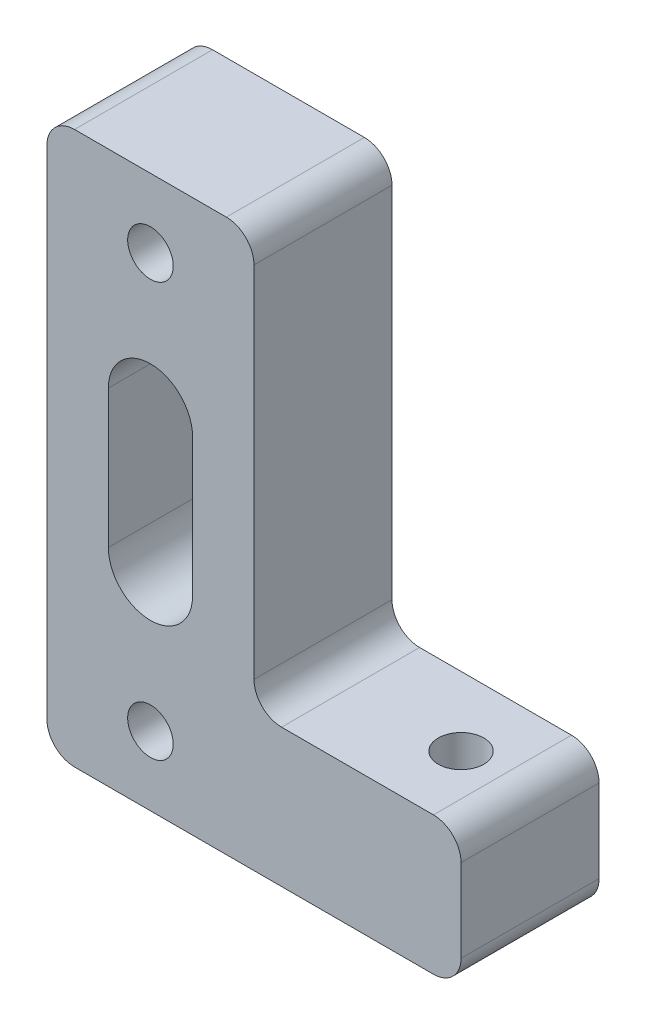
ISO-10303-21;
HEADER;
FILE_DESCRIPTION(('STEP AP214'),'2;1');
FILE_NAME('part.step','',(''),(''),'','','');
FILE_SCHEMA(('AUTOMOTIVE_DESIGN { 1 0 10303 214 1 1 1 1 }'));
ENDSEC;
DATA;
#1=APPLICATION_CONTEXT('core data for automotive mechanical design processes');
#2=APPLICATION_PROTOCOL_DEFINITION('international standard','automotive_design',2000,#1);
#3=PRODUCT_CONTEXT('',#1,'mechanical');
#4=PRODUCT('Part','Part','',(#3));
#5=PRODUCT_RELATED_PRODUCT_CATEGORY('part','',(#4));
#6=PRODUCT_DEFINITION_FORMATION('','',#4);
#7=PRODUCT_DEFINITION_CONTEXT('part definition',#1,'design');
#8=PRODUCT_DEFINITION('design','',#6,#7);
#9=PRODUCT_DEFINITION_SHAPE('','',#8);
#10=(LENGTH_UNIT() NAMED_UNIT(*) SI_UNIT(.MILLI.,.METRE.));
#11=(NAMED_UNIT(*) PLANE_ANGLE_UNIT() SI_UNIT($,.RADIAN.));
#12=(NAMED_UNIT(*) SI_UNIT($,.STERADIAN.) SOLID_ANGLE_UNIT());
#13=UNCERTAINTY_MEASURE_WITH_UNIT(LENGTH_MEASURE(1.E-05),#10,'distance_accuracy_value','');
#14=(GEOMETRIC_REPRESENTATION_CONTEXT(3) GLOBAL_UNCERTAINTY_ASSIGNED_CONTEXT((#13)) GLOBAL_UNIT_ASSIGNED_CONTEXT((#10,
#11,#12)) REPRESENTATION_CONTEXT('',''));
#15=CARTESIAN_POINT('',(0.,0.,0.));
#16=DIRECTION('',(0.,0.,1.));
#17=DIRECTION('',(1.,0.,0.));
#18=AXIS2_PLACEMENT_3D('',#15,#16,#17);
#19=CARTESIAN_POINT('',(0.,0.,10.));
#20=DIRECTION('',(0.,0.,1.));
#21=DIRECTION('',(1.,0.,0.));
#22=AXIS2_PLACEMENT_3D('',#19,#20,#21);
#23=PLANE('',#22);
#24=CARTESIAN_POINT('',(7.5,-15.,10.));
#25=DIRECTION('',(0.,0.,1.));
#26=DIRECTION('',(1.,0.,0.));
#27=AXIS2_PLACEMENT_3D('',#24,#25,#26);
#28=CIRCLE('',#27,3.05);
#29=CARTESIAN_POINT('',(10.55,-15.,10.));
#30=VERTEX_POINT('',#29);
#31=CARTESIAN_POINT('',(4.45,-15.,10.));
#32=VERTEX_POINT('',#31);
#33=EDGE_CURVE('E171',#30,#32,#28,.T.);
#34=ORIENTED_EDGE('',*,*,#33,.F.);
#35=DIRECTION('',(0.,1.,0.));
#36=VECTOR('',#35,1.);
#37=CARTESIAN_POINT('',(10.55,-15.,10.));
#38=LINE('',#37,#36);
#39=CARTESIAN_POINT('',(10.55,-25.,10.));
#40=VERTEX_POINT('',#39);
#41=EDGE_CURVE('E175',#40,#30,#38,.T.);
#42=ORIENTED_EDGE('',*,*,#41,.F.);
#43=CARTESIAN_POINT('',(7.5,-25.,10.));
#44=DIRECTION('',(0.,0.,1.));
#45=DIRECTION('',(1.,0.,0.));
#46=AXIS2_PLACEMENT_3D('',#43,#44,#45);
#47=CIRCLE('',#46,3.05);
#48=CARTESIAN_POINT('',(4.45,-25.,10.));
#49=VERTEX_POINT('',#48);
#50=EDGE_CURVE('E155',#49,#40,#47,.T.);
#51=ORIENTED_EDGE('',*,*,#50,.F.);
#52=DIRECTION('',(0.,-1.,0.));
#53=VECTOR('',#52,1.);
#54=CARTESIAN_POINT('',(4.45,-15.,10.));
#55=LINE('',#54,#53);
#56=EDGE_CURVE('E166',#32,#49,#55,.T.);
#57=ORIENTED_EDGE('',*,*,#56,.F.);
#58=EDGE_LOOP('',(#34,#42,#51,#57));
#59=FACE_BOUND('',#58,.T.);
#60=CARTESIAN_POINT('',(7.5,-5.,10.));
#61=DIRECTION('',(0.,0.,1.));
#62=DIRECTION('',(1.,0.,0.));
#63=AXIS2_PLACEMENT_3D('',#60,#61,#62);
#64=CIRCLE('',#63,1.65);
#65=CARTESIAN_POINT('',(9.15,-5.,10.));
#66=VERTEX_POINT('',#65);
#67=EDGE_CURVE('E200',#66,#66,#64,.T.);
#68=ORIENTED_EDGE('',*,*,#67,.F.);
#69=EDGE_LOOP('',(#68));
#70=FACE_BOUND('',#69,.T.);
#71=DIRECTION('',(-1.,0.,0.));
#72=VECTOR('',#71,1.);
#73=CARTESIAN_POINT('',(15.,0.,10.));
#74=LINE('',#73,#72);
#75=CARTESIAN_POINT('',(13.,0.,10.));
#76=VERTEX_POINT('',#75);
#77=CARTESIAN_POINT('',(2.,0.,10.));
#78=VERTEX_POINT('',#77);
#79=EDGE_CURVE('E206',#76,#78,#74,.T.);
#80=ORIENTED_EDGE('',*,*,#79,.T.);
#81=CARTESIAN_POINT('',(2.,-2.,10.));
#82=DIRECTION('',(0.,0.,1.));
#83=DIRECTION('',(1.,0.,0.));
#84=AXIS2_PLACEMENT_3D('',#81,#82,#83);
#85=CIRCLE('',#84,2.);
#86=CARTESIAN_POINT('',(0.,-2.,10.));
#87=VERTEX_POINT('',#86);
#88=EDGE_CURVE('E274',#78,#87,#85,.T.);
#89=ORIENTED_EDGE('',*,*,#88,.T.);
#90=DIRECTION('',(0.,-1.,0.));
#91=VECTOR('',#90,1.);
#92=CARTESIAN_POINT('',(0.,0.,10.));
#93=LINE('',#92,#91);
#94=CARTESIAN_POINT('',(0.,-38.,10.));
#95=VERTEX_POINT('',#94);
#96=EDGE_CURVE('E209',#87,#95,#93,.T.);
#97=ORIENTED_EDGE('',*,*,#96,.T.);
#98=CARTESIAN_POINT('',(2.,-38.,10.));
#99=DIRECTION('',(0.,0.,1.));
#100=DIRECTION('',(1.,0.,0.));
#101=AXIS2_PLACEMENT_3D('',#98,#99,#100);
#102=CIRCLE('',#101,2.);
#103=CARTESIAN_POINT('',(2.,-40.,10.));
#104=VERTEX_POINT('',#103);
#105=EDGE_CURVE('E267',#95,#104,#102,.T.);
#106=ORIENTED_EDGE('',*,*,#105,.T.);
#107=DIRECTION('',(1.,0.,0.));
#108=VECTOR('',#107,1.);
#109=CARTESIAN_POINT('',(0.,-40.,10.));
#110=LINE('',#109,#108);
#111=CARTESIAN_POINT('',(28.,-40.,10.));
#112=VERTEX_POINT('',#111);
#113=EDGE_CURVE('E213',#104,#112,#110,.T.);
#114=ORIENTED_EDGE('',*,*,#113,.T.);
#115=CARTESIAN_POINT('',(28.,-38.,10.));
#116=DIRECTION('',(0.,0.,1.));
#117=DIRECTION('',(1.,0.,0.));
#118=AXIS2_PLACEMENT_3D('',#115,#116,#117);
#119=CIRCLE('',#118,2.);
#120=CARTESIAN_POINT('',(30.,-38.,10.));
#121=VERTEX_POINT('',#120);
#122=EDGE_CURVE('E269',#112,#121,#119,.T.);
#123=ORIENTED_EDGE('',*,*,#122,.T.);
#124=DIRECTION('',(0.,1.,0.));
#125=VECTOR('',#124,1.);
#126=CARTESIAN_POINT('',(30.,-40.,10.));
#127=LINE('',#126,#125);
#128=CARTESIAN_POINT('',(30.,-32.,10.));
#129=VERTEX_POINT('',#128);
#130=EDGE_CURVE('E216',#121,#129,#127,.T.);
#131=ORIENTED_EDGE('',*,*,#130,.T.);
#132=CARTESIAN_POINT('',(28.,-32.,10.));
#133=DIRECTION('',(0.,0.,1.));
#134=DIRECTION('',(1.,0.,0.));
#135=AXIS2_PLACEMENT_3D('',#132,#133,#134);
#136=CIRCLE('',#135,2.);
#137=CARTESIAN_POINT('',(28.,-30.,10.));
#138=VERTEX_POINT('',#137);
#139=EDGE_CURVE('E58',#129,#138,#136,.T.);
#140=ORIENTED_EDGE('',*,*,#139,.T.);
#141=DIRECTION('',(-1.,0.,0.));
#142=VECTOR('',#141,1.);
#143=CARTESIAN_POINT('',(30.,-30.,10.));
#144=LINE('',#143,#142);
#145=CARTESIAN_POINT('',(17.,-30.,10.));
#146=VERTEX_POINT('',#145);
#147=EDGE_CURVE('E218',#138,#146,#144,.T.);
#148=ORIENTED_EDGE('',*,*,#147,.T.);
#149=CARTESIAN_POINT('',(17.,-28.,10.));
#150=DIRECTION('',(0.,0.,1.));
#151=DIRECTION('',(1.,0.,0.));
#152=AXIS2_PLACEMENT_3D('',#149,#150,#151);
#153=CIRCLE('',#152,2.);
#154=CARTESIAN_POINT('',(15.,-28.,10.));
#155=VERTEX_POINT('',#154);
#156=EDGE_CURVE('E245',#146,#155,#153,.F.);
#157=ORIENTED_EDGE('',*,*,#156,.T.);
#158=DIRECTION('',(0.,1.,0.));
#159=VECTOR('',#158,1.);
#160=CARTESIAN_POINT('',(15.,-30.,10.));
#161=LINE('',#160,#159);
#162=CARTESIAN_POINT('',(15.,-2.00000000000001,10.));
#163=VERTEX_POINT('',#162);
#164=EDGE_CURVE('E220',#155,#163,#161,.T.);
#165=ORIENTED_EDGE('',*,*,#164,.T.);
#166=CARTESIAN_POINT('',(13.,-2.,10.));
#167=DIRECTION('',(0.,0.,1.));
#168=DIRECTION('',(1.,0.,0.));
#169=AXIS2_PLACEMENT_3D('',#166,#167,#168);
#170=CIRCLE('',#169,2.);
#171=EDGE_CURVE('E272',#163,#76,#170,.T.);
#172=ORIENTED_EDGE('',*,*,#171,.T.);
#173=EDGE_LOOP('',(#80,#89,#97,#106,#114,#123,#131,#140,#148,#157,#165,#172));
#174=FACE_BOUND('',#173,.T.);
#175=CARTESIAN_POINT('',(7.5,-35.,10.));
#176=DIRECTION('',(0.,0.,1.));
#177=DIRECTION('',(1.,0.,0.));
#178=AXIS2_PLACEMENT_3D('',#175,#176,#177);
#179=CIRCLE('',#178,1.65);
#180=CARTESIAN_POINT('',(9.15,-35.,10.));
#181=VERTEX_POINT('',#180);
#182=EDGE_CURVE('E194',#181,#181,#179,.T.);
#183=ORIENTED_EDGE('',*,*,#182,.F.);
#184=EDGE_LOOP('',(#183));
#185=FACE_BOUND('',#184,.T.);
#186=ADVANCED_FACE('F35',(#59,#70,#174,#185),#23,.T.);
#187=CARTESIAN_POINT('',(0.,0.,0.));
#188=DIRECTION('',(0.,0.,1.));
#189=DIRECTION('',(1.,0.,0.));
#190=AXIS2_PLACEMENT_3D('',#187,#188,#189);
#191=PLANE('',#190);
#192=DIRECTION('',(0.,-1.,0.));
#193=VECTOR('',#192,1.);
#194=CARTESIAN_POINT('',(10.55,-15.,0.));
#195=LINE('',#194,#193);
#196=CARTESIAN_POINT('',(10.55,-15.,0.));
#197=VERTEX_POINT('',#196);
#198=CARTESIAN_POINT('',(10.55,-25.,0.));
#199=VERTEX_POINT('',#198);
#200=EDGE_CURVE('E529',#197,#199,#195,.T.);
#201=ORIENTED_EDGE('',*,*,#200,.F.);
#202=CARTESIAN_POINT('',(7.5,-15.,0.));
#203=DIRECTION('',(0.,0.,1.));
#204=DIRECTION('',(1.,0.,0.));
#205=AXIS2_PLACEMENT_3D('',#202,#203,#204);
#206=CIRCLE('',#205,3.05);
#207=CARTESIAN_POINT('',(4.45,-15.,0.));
#208=VERTEX_POINT('',#207);
#209=EDGE_CURVE('E187',#208,#197,#206,.F.);
#210=ORIENTED_EDGE('',*,*,#209,.F.);
#211=DIRECTION('',(0.,1.,0.));
#212=VECTOR('',#211,1.);
#213=CARTESIAN_POINT('',(4.45,-15.,0.));
#214=LINE('',#213,#212);
#215=CARTESIAN_POINT('',(4.45,-25.,0.));
#216=VERTEX_POINT('',#215);
#217=EDGE_CURVE('E184',#216,#208,#214,.T.);
#218=ORIENTED_EDGE('',*,*,#217,.F.);
#219=CARTESIAN_POINT('',(7.5,-25.,0.));
#220=DIRECTION('',(0.,0.,1.));
#221=DIRECTION('',(1.,0.,0.));
#222=AXIS2_PLACEMENT_3D('',#219,#220,#221);
#223=CIRCLE('',#222,3.05);
#224=EDGE_CURVE('E158',#199,#216,#223,.F.);
#225=ORIENTED_EDGE('',*,*,#224,.F.);
#226=EDGE_LOOP('',(#201,#210,#218,#225));
#227=FACE_BOUND('',#226,.T.);
#228=DIRECTION('',(0.,-1.,0.));
#229=VECTOR('',#228,1.);
#230=CARTESIAN_POINT('',(0.,0.,0.));
#231=LINE('',#230,#229);
#232=CARTESIAN_POINT('',(0.,-2.,0.));
#233=VERTEX_POINT('',#232);
#234=CARTESIAN_POINT('',(0.,-38.,0.));
#235=VERTEX_POINT('',#234);
#236=EDGE_CURVE('E225',#233,#235,#231,.T.);
#237=ORIENTED_EDGE('',*,*,#236,.F.);
#238=CARTESIAN_POINT('',(2.,-2.,0.));
#239=DIRECTION('',(0.,0.,1.));
#240=DIRECTION('',(1.,0.,0.));
#241=AXIS2_PLACEMENT_3D('',#238,#239,#240);
#242=CIRCLE('',#241,2.);
#243=CARTESIAN_POINT('',(2.,0.,0.));
#244=VERTEX_POINT('',#243);
#245=EDGE_CURVE('E260',#233,#244,#242,.F.);
#246=ORIENTED_EDGE('',*,*,#245,.T.);
#247=DIRECTION('',(-1.,0.,0.));
#248=VECTOR('',#247,1.);
#249=CARTESIAN_POINT('',(15.,0.,0.));
#250=LINE('',#249,#248);
#251=CARTESIAN_POINT('',(13.,0.,0.));
#252=VERTEX_POINT('',#251);
#253=EDGE_CURVE('E203',#252,#244,#250,.T.);
#254=ORIENTED_EDGE('',*,*,#253,.F.);
#255=CARTESIAN_POINT('',(13.,-2.,0.));
#256=DIRECTION('',(0.,0.,1.));
#257=DIRECTION('',(1.,0.,0.));
#258=AXIS2_PLACEMENT_3D('',#255,#256,#257);
#259=CIRCLE('',#258,2.);
#260=CARTESIAN_POINT('',(15.,-2.00000000000001,0.));
#261=VERTEX_POINT('',#260);
#262=EDGE_CURVE('E258',#252,#261,#259,.F.);
#263=ORIENTED_EDGE('',*,*,#262,.T.);
#264=DIRECTION('',(0.,1.,0.));
#265=VECTOR('',#264,1.);
#266=CARTESIAN_POINT('',(15.,-30.,0.));
#267=LINE('',#266,#265);
#268=CARTESIAN_POINT('',(15.,-28.,0.));
#269=VERTEX_POINT('',#268);
#270=EDGE_CURVE('E210',#269,#261,#267,.T.);
#271=ORIENTED_EDGE('',*,*,#270,.F.);
#272=CARTESIAN_POINT('',(17.,-28.,0.));
#273=DIRECTION('',(0.,0.,1.));
#274=DIRECTION('',(1.,0.,0.));
#275=AXIS2_PLACEMENT_3D('',#272,#273,#274);
#276=CIRCLE('',#275,2.);
#277=CARTESIAN_POINT('',(17.,-30.,0.));
#278=VERTEX_POINT('',#277);
#279=EDGE_CURVE('E242',#269,#278,#276,.T.);
#280=ORIENTED_EDGE('',*,*,#279,.T.);
#281=DIRECTION('',(-1.,0.,0.));
#282=VECTOR('',#281,1.);
#283=CARTESIAN_POINT('',(30.,-30.,0.));
#284=LINE('',#283,#282);
#285=CARTESIAN_POINT('',(28.,-30.,0.));
#286=VERTEX_POINT('',#285);
#287=EDGE_CURVE('E234',#286,#278,#284,.T.);
#288=ORIENTED_EDGE('',*,*,#287,.F.);
#289=CARTESIAN_POINT('',(28.,-32.,0.));
#290=DIRECTION('',(0.,0.,1.));
#291=DIRECTION('',(1.,0.,0.));
#292=AXIS2_PLACEMENT_3D('',#289,#290,#291);
#293=CIRCLE('',#292,2.);
#294=CARTESIAN_POINT('',(30.,-32.,0.));
#295=VERTEX_POINT('',#294);
#296=EDGE_CURVE('E256',#286,#295,#293,.F.);
#297=ORIENTED_EDGE('',*,*,#296,.T.);
#298=DIRECTION('',(0.,1.,0.));
#299=VECTOR('',#298,1.);
#300=CARTESIAN_POINT('',(30.,-40.,0.));
#301=LINE('',#300,#299);
#302=CARTESIAN_POINT('',(30.,-38.,0.));
#303=VERTEX_POINT('',#302);
#304=EDGE_CURVE('E231',#303,#295,#301,.T.);
#305=ORIENTED_EDGE('',*,*,#304,.F.);
#306=CARTESIAN_POINT('',(28.,-38.,0.));
#307=DIRECTION('',(0.,0.,1.));
#308=DIRECTION('',(1.,0.,0.));
#309=AXIS2_PLACEMENT_3D('',#306,#307,#308);
#310=CIRCLE('',#309,2.);
#311=CARTESIAN_POINT('',(28.,-40.,0.));
#312=VERTEX_POINT('',#311);
#313=EDGE_CURVE('E254',#303,#312,#310,.F.);
#314=ORIENTED_EDGE('',*,*,#313,.T.);
#315=DIRECTION('',(1.,0.,0.));
#316=VECTOR('',#315,1.);
#317=CARTESIAN_POINT('',(0.,-40.,0.));
#318=LINE('',#317,#316);
#319=CARTESIAN_POINT('',(2.,-40.,0.));
#320=VERTEX_POINT('',#319);
#321=EDGE_CURVE('E228',#320,#312,#318,.T.);
#322=ORIENTED_EDGE('',*,*,#321,.F.);
#323=CARTESIAN_POINT('',(2.,-38.,0.));
#324=DIRECTION('',(0.,0.,1.));
#325=DIRECTION('',(1.,0.,0.));
#326=AXIS2_PLACEMENT_3D('',#323,#324,#325);
#327=CIRCLE('',#326,2.);
#328=EDGE_CURVE('E252',#320,#235,#327,.F.);
#329=ORIENTED_EDGE('',*,*,#328,.T.);
#330=EDGE_LOOP('',(#237,#246,#254,#263,#271,#280,#288,#297,#305,#314,#322,#329));
#331=FACE_BOUND('',#330,.T.);
#332=CARTESIAN_POINT('',(7.5,-5.,0.));
#333=DIRECTION('',(0.,0.,1.));
#334=DIRECTION('',(1.,0.,0.));
#335=AXIS2_PLACEMENT_3D('',#332,#333,#334);
#336=CIRCLE('',#335,1.65);
#337=CARTESIAN_POINT('',(9.15,-5.,0.));
#338=VERTEX_POINT('',#337);
#339=EDGE_CURVE('E197',#338,#338,#336,.T.);
#340=ORIENTED_EDGE('',*,*,#339,.T.);
#341=EDGE_LOOP('',(#340));
#342=FACE_BOUND('',#341,.T.);
#343=CARTESIAN_POINT('',(7.5,-35.,0.));
#344=DIRECTION('',(0.,0.,1.));
#345=DIRECTION('',(1.,0.,0.));
#346=AXIS2_PLACEMENT_3D('',#343,#344,#345);
#347=CIRCLE('',#346,1.65);
#348=CARTESIAN_POINT('',(9.15,-35.,0.));
#349=VERTEX_POINT('',#348);
#350=EDGE_CURVE('E193',#349,#349,#347,.T.);
#351=ORIENTED_EDGE('',*,*,#350,.T.);
#352=EDGE_LOOP('',(#351));
#353=FACE_BOUND('',#352,.T.);
#354=ADVANCED_FACE('F295',(#227,#331,#342,#353),#191,.F.);
#355=CARTESIAN_POINT('',(15.,0.,10.));
#356=DIRECTION('',(0.,-1.,0.));
#357=DIRECTION('',(1.,0.,0.));
#358=AXIS2_PLACEMENT_3D('',#355,#356,#357);
#359=PLANE('',#358);
#360=ORIENTED_EDGE('',*,*,#253,.T.);
#361=DIRECTION('',(0.,0.,-1.));
#362=VECTOR('',#361,1.);
#363=CARTESIAN_POINT('',(2.,0.,10.));
#364=LINE('',#363,#362);
#365=EDGE_CURVE('E265',#244,#78,#364,.F.);
#366=ORIENTED_EDGE('',*,*,#365,.T.);
#367=ORIENTED_EDGE('',*,*,#79,.F.);
#368=DIRECTION('',(0.,0.,-1.));
#369=VECTOR('',#368,1.);
#370=CARTESIAN_POINT('',(13.,0.,10.));
#371=LINE('',#370,#369);
#372=EDGE_CURVE('E262',#76,#252,#371,.T.);
#373=ORIENTED_EDGE('',*,*,#372,.T.);
#374=EDGE_LOOP('',(#360,#366,#367,#373));
#375=FACE_BOUND('',#374,.T.);
#376=ADVANCED_FACE('F327',(#375),#359,.F.);
#377=CARTESIAN_POINT('',(0.,0.,10.));
#378=DIRECTION('',(1.,0.,0.));
#379=DIRECTION('',(0.,1.,0.));
#380=AXIS2_PLACEMENT_3D('',#377,#378,#379);
#381=PLANE('',#380);
#382=ORIENTED_EDGE('',*,*,#96,.F.);
#383=DIRECTION('',(0.,0.,-1.));
#384=VECTOR('',#383,1.);
#385=CARTESIAN_POINT('',(0.,-2.,10.));
#386=LINE('',#385,#384);
#387=EDGE_CURVE('E249',#87,#233,#386,.T.);
#388=ORIENTED_EDGE('',*,*,#387,.T.);
#389=ORIENTED_EDGE('',*,*,#236,.T.);
#390=DIRECTION('',(0.,0.,-1.));
#391=VECTOR('',#390,1.);
#392=CARTESIAN_POINT('',(0.,-38.,10.));
#393=LINE('',#392,#391);
#394=EDGE_CURVE('E247',#235,#95,#393,.F.);
#395=ORIENTED_EDGE('',*,*,#394,.T.);
#396=EDGE_LOOP('',(#382,#388,#389,#395));
#397=FACE_BOUND('',#396,.T.);
#398=ADVANCED_FACE('F335',(#397),#381,.F.);
#399=CARTESIAN_POINT('',(0.,-40.,10.));
#400=DIRECTION('',(0.,1.,0.));
#401=DIRECTION('',(0.,0.,1.));
#402=AXIS2_PLACEMENT_3D('',#399,#400,#401);
#403=PLANE('',#402);
#404=CARTESIAN_POINT('',(25.,-40.,5.));
#405=DIRECTION('',(0.,-1.,0.));
#406=DIRECTION('',(0.,0.,-1.));
#407=AXIS2_PLACEMENT_3D('',#404,#405,#406);
#408=CIRCLE('',#407,1.65000000000001);
#409=CARTESIAN_POINT('',(25.,-40.,3.34999999999999));
#410=VERTEX_POINT('',#409);
#411=EDGE_CURVE('E186',#410,#410,#408,.T.);
#412=ORIENTED_EDGE('',*,*,#411,.F.);
#413=EDGE_LOOP('',(#412));
#414=FACE_BOUND('',#413,.T.);
#415=ORIENTED_EDGE('',*,*,#321,.T.);
#416=DIRECTION('',(0.,0.,-1.));
#417=VECTOR('',#416,1.);
#418=CARTESIAN_POINT('',(28.,-40.,10.));
#419=LINE('',#418,#417);
#420=EDGE_CURVE('E11',#312,#112,#419,.F.);
#421=ORIENTED_EDGE('',*,*,#420,.T.);
#422=ORIENTED_EDGE('',*,*,#113,.F.);
#423=DIRECTION('',(0.,0.,-1.));
#424=VECTOR('',#423,1.);
#425=CARTESIAN_POINT('',(2.,-40.,10.));
#426=LINE('',#425,#424);
#427=EDGE_CURVE('E43',#104,#320,#426,.T.);
#428=ORIENTED_EDGE('',*,*,#427,.T.);
#429=EDGE_LOOP('',(#415,#421,#422,#428));
#430=FACE_BOUND('',#429,.T.);
#431=ADVANCED_FACE('F289',(#414,#430),#403,.F.);
#432=CARTESIAN_POINT('',(30.,-40.,10.));
#433=DIRECTION('',(-1.,0.,0.));
#434=DIRECTION('',(0.,0.,1.));
#435=AXIS2_PLACEMENT_3D('',#432,#433,#434);
#436=PLANE('',#435);
#437=ORIENTED_EDGE('',*,*,#304,.T.);
#438=DIRECTION('',(0.,0.,-1.));
#439=VECTOR('',#438,1.);
#440=CARTESIAN_POINT('',(30.,-32.,10.));
#441=LINE('',#440,#439);
#442=EDGE_CURVE('E283',#295,#129,#441,.F.);
#443=ORIENTED_EDGE('',*,*,#442,.T.);
#444=ORIENTED_EDGE('',*,*,#130,.F.);
#445=DIRECTION('',(0.,0.,-1.));
#446=VECTOR('',#445,1.);
#447=CARTESIAN_POINT('',(30.,-38.,10.));
#448=LINE('',#447,#446);
#449=EDGE_CURVE('E280',#121,#303,#448,.T.);
#450=ORIENTED_EDGE('',*,*,#449,.T.);
#451=EDGE_LOOP('',(#437,#443,#444,#450));
#452=FACE_BOUND('',#451,.T.);
#453=ADVANCED_FACE('F304',(#452),#436,.F.);
#454=CARTESIAN_POINT('',(30.,-30.,10.));
#455=DIRECTION('',(0.,-1.,0.));
#456=DIRECTION('',(1.,0.,0.));
#457=AXIS2_PLACEMENT_3D('',#454,#455,#456);
#458=PLANE('',#457);
#459=CARTESIAN_POINT('',(25.,-30.,5.));
#460=DIRECTION('',(0.,-1.,0.));
#461=DIRECTION('',(1.,0.,0.));
#462=AXIS2_PLACEMENT_3D('',#459,#460,#461);
#463=CIRCLE('',#462,1.65000000000001);
#464=CARTESIAN_POINT('',(26.65,-30.,5.));
#465=VERTEX_POINT('',#464);
#466=EDGE_CURVE('E190',#465,#465,#463,.F.);
#467=ORIENTED_EDGE('',*,*,#466,.F.);
#468=EDGE_LOOP('',(#467));
#469=FACE_BOUND('',#468,.T.);
#470=ORIENTED_EDGE('',*,*,#147,.F.);
#471=DIRECTION('',(0.,0.,-1.));
#472=VECTOR('',#471,1.);
#473=CARTESIAN_POINT('',(28.,-30.,10.));
#474=LINE('',#473,#472);
#475=EDGE_CURVE('E277',#138,#286,#474,.T.);
#476=ORIENTED_EDGE('',*,*,#475,.T.);
#477=ORIENTED_EDGE('',*,*,#287,.T.);
#478=DIRECTION('',(0.,0.,-1.));
#479=VECTOR('',#478,1.);
#480=CARTESIAN_POINT('',(17.,-30.,10.));
#481=LINE('',#480,#479);
#482=EDGE_CURVE('E239',#278,#146,#481,.F.);
#483=ORIENTED_EDGE('',*,*,#482,.T.);
#484=EDGE_LOOP('',(#470,#476,#477,#483));
#485=FACE_BOUND('',#484,.T.);
#486=ADVANCED_FACE('F312',(#469,#485),#458,.F.);
#487=CARTESIAN_POINT('',(15.,-30.,10.));
#488=DIRECTION('',(-1.,0.,0.));
#489=DIRECTION('',(0.,0.,1.));
#490=AXIS2_PLACEMENT_3D('',#487,#488,#489);
#491=PLANE('',#490);
#492=ORIENTED_EDGE('',*,*,#270,.T.);
#493=DIRECTION('',(0.,0.,-1.));
#494=VECTOR('',#493,1.);
#495=CARTESIAN_POINT('',(15.,-2.,10.));
#496=LINE('',#495,#494);
#497=EDGE_CURVE('E50',#261,#163,#496,.F.);
#498=ORIENTED_EDGE('',*,*,#497,.T.);
#499=ORIENTED_EDGE('',*,*,#164,.F.);
#500=DIRECTION('',(0.,0.,-1.));
#501=VECTOR('',#500,1.);
#502=CARTESIAN_POINT('',(15.,-28.,0.));
#503=LINE('',#502,#501);
#504=EDGE_CURVE('E222',#155,#269,#503,.T.);
#505=ORIENTED_EDGE('',*,*,#504,.T.);
#506=EDGE_LOOP('',(#492,#498,#499,#505));
#507=FACE_BOUND('',#506,.T.);
#508=ADVANCED_FACE('F320',(#507),#491,.F.);
#509=CARTESIAN_POINT('',(7.5,-5.,10.));
#510=DIRECTION('',(0.,0.,-1.));
#511=DIRECTION('',(-1.,0.,0.));
#512=AXIS2_PLACEMENT_3D('',#509,#510,#511);
#513=CYLINDRICAL_SURFACE('',#512,1.65);
#514=ORIENTED_EDGE('',*,*,#67,.T.);
#515=EDGE_LOOP('',(#514));
#516=FACE_BOUND('',#515,.T.);
#517=ORIENTED_EDGE('',*,*,#339,.F.);
#518=EDGE_LOOP('',(#517));
#519=FACE_BOUND('',#518,.T.);
#520=ADVANCED_FACE('F349',(#516,#519),#513,.F.);
#521=CARTESIAN_POINT('',(7.5,-35.,10.));
#522=DIRECTION('',(0.,0.,-1.));
#523=DIRECTION('',(-1.,0.,0.));
#524=AXIS2_PLACEMENT_3D('',#521,#522,#523);
#525=CYLINDRICAL_SURFACE('',#524,1.65);
#526=ORIENTED_EDGE('',*,*,#182,.T.);
#527=EDGE_LOOP('',(#526));
#528=FACE_BOUND('',#527,.T.);
#529=ORIENTED_EDGE('',*,*,#350,.F.);
#530=EDGE_LOOP('',(#529));
#531=FACE_BOUND('',#530,.T.);
#532=ADVANCED_FACE('F445',(#528,#531),#525,.F.);
#533=CARTESIAN_POINT('',(25.,-25.3330952441688,5.));
#534=DIRECTION('',(0.,-1.,0.));
#535=DIRECTION('',(0.,0.,-1.));
#536=AXIS2_PLACEMENT_3D('',#533,#534,#535);
#537=CYLINDRICAL_SURFACE('',#536,1.65000000000001);
#538=ORIENTED_EDGE('',*,*,#466,.T.);
#539=EDGE_LOOP('',(#538));
#540=FACE_BOUND('',#539,.T.);
#541=ORIENTED_EDGE('',*,*,#411,.T.);
#542=EDGE_LOOP('',(#541));
#543=FACE_BOUND('',#542,.T.);
#544=ADVANCED_FACE('F436',(#540,#543),#537,.F.);
#545=CARTESIAN_POINT('',(7.5,-15.,-17.2168522093907));
#546=DIRECTION('',(0.,0.,1.));
#547=DIRECTION('',(1.,0.,0.));
#548=AXIS2_PLACEMENT_3D('',#545,#546,#547);
#549=CYLINDRICAL_SURFACE('',#548,3.05);
#550=ORIENTED_EDGE('',*,*,#209,.T.);
#551=DIRECTION('',(0.,0.,1.));
#552=VECTOR('',#551,1.);
#553=CARTESIAN_POINT('',(10.55,-15.,-17.2168522093907));
#554=LINE('',#553,#552);
#555=EDGE_CURVE('E180',#197,#30,#554,.T.);
#556=ORIENTED_EDGE('',*,*,#555,.T.);
#557=ORIENTED_EDGE('',*,*,#33,.T.);
#558=DIRECTION('',(0.,0.,1.));
#559=VECTOR('',#558,1.);
#560=CARTESIAN_POINT('',(4.45,-15.,-17.2168522093907));
#561=LINE('',#560,#559);
#562=EDGE_CURVE('E162',#208,#32,#561,.T.);
#563=ORIENTED_EDGE('',*,*,#562,.F.);
#564=EDGE_LOOP('',(#550,#556,#557,#563));
#565=FACE_BOUND('',#564,.T.);
#566=ADVANCED_FACE('F427',(#565),#549,.F.);
#567=CARTESIAN_POINT('',(10.55,-15.,-17.2168522093907));
#568=DIRECTION('',(1.,0.,0.));
#569=DIRECTION('',(0.,1.,0.));
#570=AXIS2_PLACEMENT_3D('',#567,#568,#569);
#571=PLANE('',#570);
#572=ORIENTED_EDGE('',*,*,#200,.T.);
#573=DIRECTION('',(0.,0.,1.));
#574=VECTOR('',#573,1.);
#575=CARTESIAN_POINT('',(10.55,-25.,-17.2168522093907));
#576=LINE('',#575,#574);
#577=EDGE_CURVE('E161',#199,#40,#576,.T.);
#578=ORIENTED_EDGE('',*,*,#577,.T.);
#579=ORIENTED_EDGE('',*,*,#41,.T.);
#580=ORIENTED_EDGE('',*,*,#555,.F.);
#581=EDGE_LOOP('',(#572,#578,#579,#580));
#582=FACE_BOUND('',#581,.T.);
#583=ADVANCED_FACE('F419',(#582),#571,.F.);
#584=CARTESIAN_POINT('',(7.5,-25.,-17.2168522093907));
#585=DIRECTION('',(0.,0.,1.));
#586=DIRECTION('',(1.,0.,0.));
#587=AXIS2_PLACEMENT_3D('',#584,#585,#586);
#588=CYLINDRICAL_SURFACE('',#587,3.05);
#589=ORIENTED_EDGE('',*,*,#224,.T.);
#590=DIRECTION('',(0.,0.,1.));
#591=VECTOR('',#590,1.);
#592=CARTESIAN_POINT('',(4.45,-25.,-17.2168522093907));
#593=LINE('',#592,#591);
#594=EDGE_CURVE('E150',#216,#49,#593,.T.);
#595=ORIENTED_EDGE('',*,*,#594,.T.);
#596=ORIENTED_EDGE('',*,*,#50,.T.);
#597=ORIENTED_EDGE('',*,*,#577,.F.);
#598=EDGE_LOOP('',(#589,#595,#596,#597));
#599=FACE_BOUND('',#598,.T.);
#600=ADVANCED_FACE('F152',(#599),#588,.F.);
#601=CARTESIAN_POINT('',(4.45,-15.,-17.2168522093907));
#602=DIRECTION('',(-1.,0.,0.));
#603=DIRECTION('',(0.,-1.,0.));
#604=AXIS2_PLACEMENT_3D('',#601,#602,#603);
#605=PLANE('',#604);
#606=ORIENTED_EDGE('',*,*,#217,.T.);
#607=ORIENTED_EDGE('',*,*,#562,.T.);
#608=ORIENTED_EDGE('',*,*,#56,.T.);
#609=ORIENTED_EDGE('',*,*,#594,.F.);
#610=EDGE_LOOP('',(#606,#607,#608,#609));
#611=FACE_BOUND('',#610,.T.);
#612=ADVANCED_FACE('F167',(#611),#605,.F.);
#613=CARTESIAN_POINT('',(17.,-28.,10.));
#614=DIRECTION('',(0.,0.,1.));
#615=DIRECTION('',(1.,0.,0.));
#616=AXIS2_PLACEMENT_3D('',#613,#614,#615);
#617=CYLINDRICAL_SURFACE('',#616,2.);
#618=ORIENTED_EDGE('',*,*,#156,.F.);
#619=ORIENTED_EDGE('',*,*,#482,.F.);
#620=ORIENTED_EDGE('',*,*,#279,.F.);
#621=ORIENTED_EDGE('',*,*,#504,.F.);
#622=EDGE_LOOP('',(#618,#619,#620,#621));
#623=FACE_BOUND('',#622,.T.);
#624=ADVANCED_FACE('F318',(#623),#617,.F.);
#625=CARTESIAN_POINT('',(2.,-2.,10.));
#626=DIRECTION('',(0.,0.,-1.));
#627=DIRECTION('',(-1.,0.,0.));
#628=AXIS2_PLACEMENT_3D('',#625,#626,#627);
#629=CYLINDRICAL_SURFACE('',#628,2.);
#630=ORIENTED_EDGE('',*,*,#88,.F.);
#631=ORIENTED_EDGE('',*,*,#365,.F.);
#632=ORIENTED_EDGE('',*,*,#245,.F.);
#633=ORIENTED_EDGE('',*,*,#387,.F.);
#634=EDGE_LOOP('',(#630,#631,#632,#633));
#635=FACE_BOUND('',#634,.T.);
#636=ADVANCED_FACE('F331',(#635),#629,.T.);
#637=CARTESIAN_POINT('',(13.,-2.,10.));
#638=DIRECTION('',(0.,0.,-1.));
#639=DIRECTION('',(-1.,0.,0.));
#640=AXIS2_PLACEMENT_3D('',#637,#638,#639);
#641=CYLINDRICAL_SURFACE('',#640,2.);
#642=ORIENTED_EDGE('',*,*,#171,.F.);
#643=ORIENTED_EDGE('',*,*,#497,.F.);
#644=ORIENTED_EDGE('',*,*,#262,.F.);
#645=ORIENTED_EDGE('',*,*,#372,.F.);
#646=EDGE_LOOP('',(#642,#643,#644,#645));
#647=FACE_BOUND('',#646,.T.);
#648=ADVANCED_FACE('F322',(#647),#641,.T.);
#649=CARTESIAN_POINT('',(28.,-32.,10.));
#650=DIRECTION('',(0.,0.,-1.));
#651=DIRECTION('',(-1.,0.,0.));
#652=AXIS2_PLACEMENT_3D('',#649,#650,#651);
#653=CYLINDRICAL_SURFACE('',#652,2.);
#654=ORIENTED_EDGE('',*,*,#139,.F.);
#655=ORIENTED_EDGE('',*,*,#442,.F.);
#656=ORIENTED_EDGE('',*,*,#296,.F.);
#657=ORIENTED_EDGE('',*,*,#475,.F.);
#658=EDGE_LOOP('',(#654,#655,#656,#657));
#659=FACE_BOUND('',#658,.T.);
#660=ADVANCED_FACE('F309',(#659),#653,.T.);
#661=CARTESIAN_POINT('',(28.,-38.,10.));
#662=DIRECTION('',(0.,0.,-1.));
#663=DIRECTION('',(-1.,0.,0.));
#664=AXIS2_PLACEMENT_3D('',#661,#662,#663);
#665=CYLINDRICAL_SURFACE('',#664,2.);
#666=ORIENTED_EDGE('',*,*,#122,.F.);
#667=ORIENTED_EDGE('',*,*,#420,.F.);
#668=ORIENTED_EDGE('',*,*,#313,.F.);
#669=ORIENTED_EDGE('',*,*,#449,.F.);
#670=EDGE_LOOP('',(#666,#667,#668,#669));
#671=FACE_BOUND('',#670,.T.);
#672=ADVANCED_FACE('F301',(#671),#665,.T.);
#673=CARTESIAN_POINT('',(2.,-38.,10.));
#674=DIRECTION('',(0.,0.,-1.));
#675=DIRECTION('',(-1.,0.,0.));
#676=AXIS2_PLACEMENT_3D('',#673,#674,#675);
#677=CYLINDRICAL_SURFACE('',#676,2.);
#678=ORIENTED_EDGE('',*,*,#105,.F.);
#679=ORIENTED_EDGE('',*,*,#394,.F.);
#680=ORIENTED_EDGE('',*,*,#328,.F.);
#681=ORIENTED_EDGE('',*,*,#427,.F.);
#682=EDGE_LOOP('',(#678,#679,#680,#681));
#683=FACE_BOUND('',#682,.T.);
#684=ADVANCED_FACE('F37',(#683),#677,.T.);
#685=CLOSED_SHELL('',(#186,#354,#376,#398,#431,#453,#486,#508,#520,#532,#544,#566,#583,#600,
#612,#624,#636,#648,#660,#672,#684));
#686=MANIFOLD_SOLID_BREP('B2',#685);
#687=ADVANCED_BREP_SHAPE_REPRESENTATION('',(#18,#686),#14);
#688=SHAPE_DEFINITION_REPRESENTATION(#9,#687);
ENDSEC;
END-ISO-10303-21;
